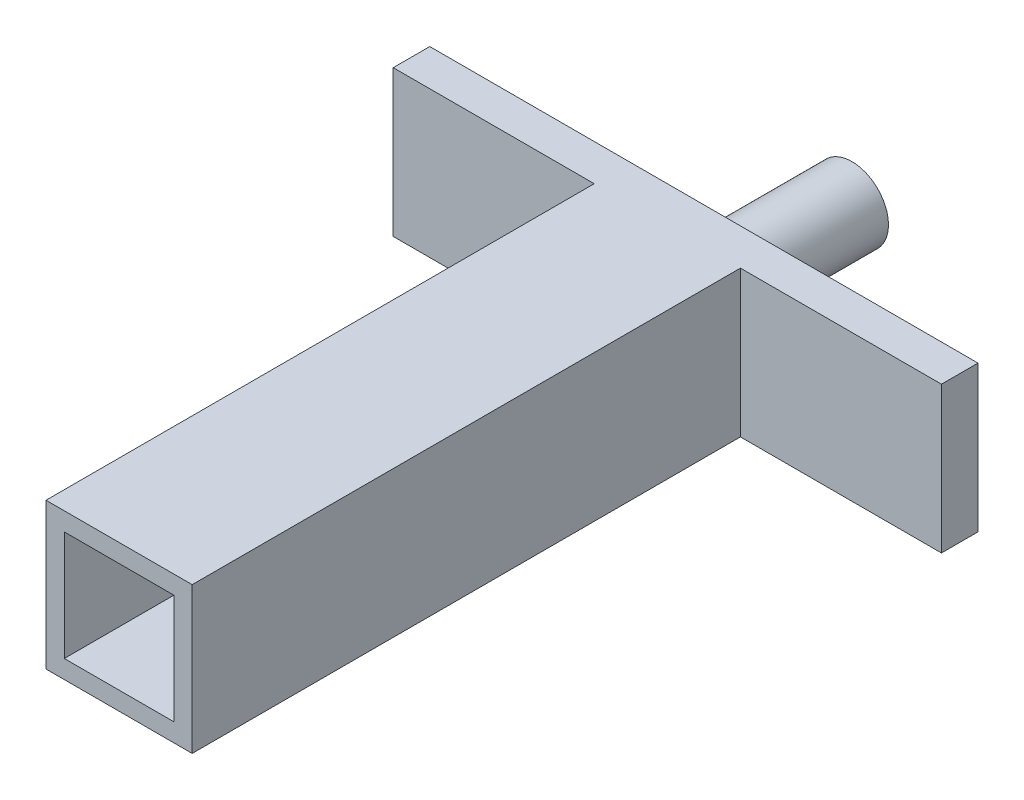
ISO-10303-21;
HEADER;
FILE_DESCRIPTION(('STEP AP214'),'2;1');
FILE_NAME('part.step','',(''),(''),'','','');
FILE_SCHEMA(('AUTOMOTIVE_DESIGN { 1 0 10303 214 1 1 1 1 }'));
ENDSEC;
DATA;
#1=APPLICATION_CONTEXT('core data for automotive mechanical design processes');
#2=APPLICATION_PROTOCOL_DEFINITION('international standard','automotive_design',2000,#1);
#3=PRODUCT_CONTEXT('',#1,'mechanical');
#4=PRODUCT('Part','Part','',(#3));
#5=PRODUCT_RELATED_PRODUCT_CATEGORY('part','',(#4));
#6=PRODUCT_DEFINITION_FORMATION('','',#4);
#7=PRODUCT_DEFINITION_CONTEXT('part definition',#1,'design');
#8=PRODUCT_DEFINITION('design','',#6,#7);
#9=PRODUCT_DEFINITION_SHAPE('','',#8);
#10=(LENGTH_UNIT() NAMED_UNIT(*) SI_UNIT(.MILLI.,.METRE.));
#11=(NAMED_UNIT(*) PLANE_ANGLE_UNIT() SI_UNIT($,.RADIAN.));
#12=(NAMED_UNIT(*) SI_UNIT($,.STERADIAN.) SOLID_ANGLE_UNIT());
#13=UNCERTAINTY_MEASURE_WITH_UNIT(LENGTH_MEASURE(1.E-05),#10,'distance_accuracy_value','');
#14=(GEOMETRIC_REPRESENTATION_CONTEXT(3) GLOBAL_UNCERTAINTY_ASSIGNED_CONTEXT((#13)) GLOBAL_UNIT_ASSIGNED_CONTEXT((#10,
#11,#12)) REPRESENTATION_CONTEXT('',''));
#15=CARTESIAN_POINT('',(0.,0.,0.));
#16=DIRECTION('',(0.,0.,1.));
#17=DIRECTION('',(1.,0.,0.));
#18=AXIS2_PLACEMENT_3D('',#15,#16,#17);
#19=CARTESIAN_POINT('',(2.,2.,16.));
#20=DIRECTION('',(-1.,0.,0.));
#21=DIRECTION('',(0.,-1.,0.));
#22=AXIS2_PLACEMENT_3D('',#19,#20,#21);
#23=PLANE('',#22);
#24=DIRECTION('',(0.,0.,-1.));
#25=VECTOR('',#24,1.);
#26=CARTESIAN_POINT('',(2.,-2.,16.));
#27=LINE('',#26,#25);
#28=CARTESIAN_POINT('',(2.,-2.,16.));
#29=VERTEX_POINT('',#28);
#30=CARTESIAN_POINT('',(2.,-2.,1.));
#31=VERTEX_POINT('',#30);
#32=EDGE_CURVE('E187',#29,#31,#27,.T.);
#33=ORIENTED_EDGE('',*,*,#32,.T.);
#34=DIRECTION('',(0.,1.,0.));
#35=VECTOR('',#34,1.);
#36=CARTESIAN_POINT('',(2.,2.,1.));
#37=LINE('',#36,#35);
#38=CARTESIAN_POINT('',(2.,2.,1.));
#39=VERTEX_POINT('',#38);
#40=EDGE_CURVE('E284',#31,#39,#37,.T.);
#41=ORIENTED_EDGE('',*,*,#40,.T.);
#42=DIRECTION('',(0.,0.,-1.));
#43=VECTOR('',#42,1.);
#44=CARTESIAN_POINT('',(2.,2.,16.));
#45=LINE('',#44,#43);
#46=CARTESIAN_POINT('',(2.,2.,16.));
#47=VERTEX_POINT('',#46);
#48=EDGE_CURVE('E183',#47,#39,#45,.T.);
#49=ORIENTED_EDGE('',*,*,#48,.F.);
#50=DIRECTION('',(0.,1.,0.));
#51=VECTOR('',#50,1.);
#52=CARTESIAN_POINT('',(2.,2.,16.));
#53=LINE('',#52,#51);
#54=EDGE_CURVE('E195',#29,#47,#53,.T.);
#55=ORIENTED_EDGE('',*,*,#54,.F.);
#56=EDGE_LOOP('',(#33,#41,#49,#55));
#57=FACE_BOUND('',#56,.T.);
#58=ADVANCED_FACE('F50',(#57),#23,.F.);
#59=CARTESIAN_POINT('',(-2.,2.,16.));
#60=DIRECTION('',(0.,-1.,0.));
#61=DIRECTION('',(0.,0.,-1.));
#62=AXIS2_PLACEMENT_3D('',#59,#60,#61);
#63=PLANE('',#62);
#64=DIRECTION('',(-1.,0.,0.));
#65=VECTOR('',#64,1.);
#66=CARTESIAN_POINT('',(-2.,2.,0.));
#67=LINE('',#66,#65);
#68=CARTESIAN_POINT('',(7.5,2.,0.));
#69=VERTEX_POINT('',#68);
#70=CARTESIAN_POINT('',(-7.5,2.,0.));
#71=VERTEX_POINT('',#70);
#72=EDGE_CURVE('E196',#69,#71,#67,.T.);
#73=ORIENTED_EDGE('',*,*,#72,.T.);
#74=DIRECTION('',(0.,0.,-1.));
#75=VECTOR('',#74,1.);
#76=CARTESIAN_POINT('',(-7.5,2.,1.));
#77=LINE('',#76,#75);
#78=CARTESIAN_POINT('',(-7.5,2.,1.));
#79=VERTEX_POINT('',#78);
#80=EDGE_CURVE('E178',#79,#71,#77,.T.);
#81=ORIENTED_EDGE('',*,*,#80,.F.);
#82=DIRECTION('',(1.,0.,0.));
#83=VECTOR('',#82,1.);
#84=CARTESIAN_POINT('',(-1.99999999999998,2.,1.));
#85=LINE('',#84,#83);
#86=CARTESIAN_POINT('',(-1.99999999999998,2.,1.));
#87=VERTEX_POINT('',#86);
#88=EDGE_CURVE('E165',#79,#87,#85,.T.);
#89=ORIENTED_EDGE('',*,*,#88,.T.);
#90=DIRECTION('',(0.,0.,-1.));
#91=VECTOR('',#90,1.);
#92=CARTESIAN_POINT('',(-2.,2.,16.));
#93=LINE('',#92,#91);
#94=CARTESIAN_POINT('',(-2.,2.,16.));
#95=VERTEX_POINT('',#94);
#96=EDGE_CURVE('E175',#95,#87,#93,.T.);
#97=ORIENTED_EDGE('',*,*,#96,.F.);
#98=DIRECTION('',(-1.,0.,0.));
#99=VECTOR('',#98,1.);
#100=CARTESIAN_POINT('',(-2.,2.,16.));
#101=LINE('',#100,#99);
#102=EDGE_CURVE('E201',#47,#95,#101,.T.);
#103=ORIENTED_EDGE('',*,*,#102,.F.);
#104=ORIENTED_EDGE('',*,*,#48,.T.);
#105=DIRECTION('',(1.,0.,0.));
#106=VECTOR('',#105,1.);
#107=CARTESIAN_POINT('',(2.,2.,1.));
#108=LINE('',#107,#106);
#109=CARTESIAN_POINT('',(7.5,2.,1.));
#110=VERTEX_POINT('',#109);
#111=EDGE_CURVE('E72',#39,#110,#108,.T.);
#112=ORIENTED_EDGE('',*,*,#111,.T.);
#113=DIRECTION('',(0.,0.,-1.));
#114=VECTOR('',#113,1.);
#115=CARTESIAN_POINT('',(7.5,2.,1.));
#116=LINE('',#115,#114);
#117=EDGE_CURVE('E275',#110,#69,#116,.T.);
#118=ORIENTED_EDGE('',*,*,#117,.T.);
#119=EDGE_LOOP('',(#73,#81,#89,#97,#103,#104,#112,#118));
#120=FACE_BOUND('',#119,.T.);
#121=ADVANCED_FACE('F174',(#120),#63,.F.);
#122=CARTESIAN_POINT('',(-2.,2.,16.));
#123=DIRECTION('',(1.,0.,0.));
#124=DIRECTION('',(0.,1.,0.));
#125=AXIS2_PLACEMENT_3D('',#122,#123,#124);
#126=PLANE('',#125);
#127=ORIENTED_EDGE('',*,*,#96,.T.);
#128=DIRECTION('',(0.,-1.,0.));
#129=VECTOR('',#128,1.);
#130=CARTESIAN_POINT('',(-1.99999999999998,2.,1.));
#131=LINE('',#130,#129);
#132=CARTESIAN_POINT('',(-2.,-2.,1.));
#133=VERTEX_POINT('',#132);
#134=EDGE_CURVE('E162',#87,#133,#131,.T.);
#135=ORIENTED_EDGE('',*,*,#134,.T.);
#136=DIRECTION('',(0.,0.,-1.));
#137=VECTOR('',#136,1.);
#138=CARTESIAN_POINT('',(-2.,-2.,16.));
#139=LINE('',#138,#137);
#140=CARTESIAN_POINT('',(-2.,-2.,16.));
#141=VERTEX_POINT('',#140);
#142=EDGE_CURVE('E184',#141,#133,#139,.T.);
#143=ORIENTED_EDGE('',*,*,#142,.F.);
#144=DIRECTION('',(0.,-1.,0.));
#145=VECTOR('',#144,1.);
#146=CARTESIAN_POINT('',(-2.,2.,16.));
#147=LINE('',#146,#145);
#148=EDGE_CURVE('E182',#95,#141,#147,.T.);
#149=ORIENTED_EDGE('',*,*,#148,.F.);
#150=EDGE_LOOP('',(#127,#135,#143,#149));
#151=FACE_BOUND('',#150,.T.);
#152=ADVANCED_FACE('F181',(#151),#126,.F.);
#153=CARTESIAN_POINT('',(-2.,-2.,16.));
#154=DIRECTION('',(0.,1.,0.));
#155=DIRECTION('',(0.,0.,1.));
#156=AXIS2_PLACEMENT_3D('',#153,#154,#155);
#157=PLANE('',#156);
#158=DIRECTION('',(1.,0.,0.));
#159=VECTOR('',#158,1.);
#160=CARTESIAN_POINT('',(-2.,-2.,0.));
#161=LINE('',#160,#159);
#162=CARTESIAN_POINT('',(-7.5,-2.,0.));
#163=VERTEX_POINT('',#162);
#164=CARTESIAN_POINT('',(7.5,-2.,0.));
#165=VERTEX_POINT('',#164);
#166=EDGE_CURVE('E193',#163,#165,#161,.T.);
#167=ORIENTED_EDGE('',*,*,#166,.T.);
#168=DIRECTION('',(0.,0.,-1.));
#169=VECTOR('',#168,1.);
#170=CARTESIAN_POINT('',(7.5,-2.,1.));
#171=LINE('',#170,#169);
#172=CARTESIAN_POINT('',(7.5,-2.,1.));
#173=VERTEX_POINT('',#172);
#174=EDGE_CURVE('E264',#173,#165,#171,.T.);
#175=ORIENTED_EDGE('',*,*,#174,.F.);
#176=DIRECTION('',(-1.,0.,0.));
#177=VECTOR('',#176,1.);
#178=CARTESIAN_POINT('',(7.5,-2.,1.));
#179=LINE('',#178,#177);
#180=EDGE_CURVE('E278',#173,#31,#179,.T.);
#181=ORIENTED_EDGE('',*,*,#180,.T.);
#182=ORIENTED_EDGE('',*,*,#32,.F.);
#183=DIRECTION('',(1.,0.,0.));
#184=VECTOR('',#183,1.);
#185=CARTESIAN_POINT('',(-2.,-2.,16.));
#186=LINE('',#185,#184);
#187=EDGE_CURVE('E192',#141,#29,#186,.T.);
#188=ORIENTED_EDGE('',*,*,#187,.F.);
#189=ORIENTED_EDGE('',*,*,#142,.T.);
#190=DIRECTION('',(-1.,0.,0.));
#191=VECTOR('',#190,1.);
#192=CARTESIAN_POINT('',(-7.5,-2.,1.));
#193=LINE('',#192,#191);
#194=CARTESIAN_POINT('',(-7.5,-2.,1.));
#195=VERTEX_POINT('',#194);
#196=EDGE_CURVE('E64',#133,#195,#193,.T.);
#197=ORIENTED_EDGE('',*,*,#196,.T.);
#198=DIRECTION('',(0.,0.,-1.));
#199=VECTOR('',#198,1.);
#200=CARTESIAN_POINT('',(-7.5,-2.,1.));
#201=LINE('',#200,#199);
#202=EDGE_CURVE('E292',#195,#163,#201,.T.);
#203=ORIENTED_EDGE('',*,*,#202,.T.);
#204=EDGE_LOOP('',(#167,#175,#181,#182,#188,#189,#197,#203));
#205=FACE_BOUND('',#204,.T.);
#206=ADVANCED_FACE('F301',(#205),#157,.F.);
#207=CARTESIAN_POINT('',(0.,0.,16.));
#208=DIRECTION('',(0.,0.,1.));
#209=DIRECTION('',(1.,0.,0.));
#210=AXIS2_PLACEMENT_3D('',#207,#208,#209);
#211=PLANE('',#210);
#212=DIRECTION('',(0.,1.,0.));
#213=VECTOR('',#212,1.);
#214=CARTESIAN_POINT('',(1.5,2.,16.));
#215=LINE('',#214,#213);
#216=CARTESIAN_POINT('',(1.5,-1.5,16.));
#217=VERTEX_POINT('',#216);
#218=CARTESIAN_POINT('',(1.5,1.5,16.));
#219=VERTEX_POINT('',#218);
#220=EDGE_CURVE('E213',#217,#219,#215,.T.);
#221=ORIENTED_EDGE('',*,*,#220,.F.);
#222=DIRECTION('',(1.,0.,0.));
#223=VECTOR('',#222,1.);
#224=CARTESIAN_POINT('',(-2.,-1.5,16.));
#225=LINE('',#224,#223);
#226=CARTESIAN_POINT('',(-1.5,-1.5,16.));
#227=VERTEX_POINT('',#226);
#228=EDGE_CURVE('E205',#227,#217,#225,.T.);
#229=ORIENTED_EDGE('',*,*,#228,.F.);
#230=DIRECTION('',(0.,-1.,0.));
#231=VECTOR('',#230,1.);
#232=CARTESIAN_POINT('',(-1.5,2.,16.));
#233=LINE('',#232,#231);
#234=CARTESIAN_POINT('',(-1.5,1.5,16.));
#235=VERTEX_POINT('',#234);
#236=EDGE_CURVE('E208',#235,#227,#233,.T.);
#237=ORIENTED_EDGE('',*,*,#236,.F.);
#238=DIRECTION('',(-1.,0.,0.));
#239=VECTOR('',#238,1.);
#240=CARTESIAN_POINT('',(-2.,1.5,16.));
#241=LINE('',#240,#239);
#242=EDGE_CURVE('E211',#219,#235,#241,.T.);
#243=ORIENTED_EDGE('',*,*,#242,.F.);
#244=EDGE_LOOP('',(#221,#229,#237,#243));
#245=FACE_BOUND('',#244,.T.);
#246=ORIENTED_EDGE('',*,*,#54,.T.);
#247=ORIENTED_EDGE('',*,*,#102,.T.);
#248=ORIENTED_EDGE('',*,*,#148,.T.);
#249=ORIENTED_EDGE('',*,*,#187,.T.);
#250=EDGE_LOOP('',(#246,#247,#248,#249));
#251=FACE_BOUND('',#250,.T.);
#252=ADVANCED_FACE('F318',(#245,#251),#211,.T.);
#253=CARTESIAN_POINT('',(0.,0.,0.));
#254=DIRECTION('',(0.,0.,1.));
#255=DIRECTION('',(1.,0.,0.));
#256=AXIS2_PLACEMENT_3D('',#253,#254,#255);
#257=PLANE('',#256);
#258=CARTESIAN_POINT('',(0.,0.,0.));
#259=DIRECTION('',(0.,0.,-1.));
#260=DIRECTION('',(-1.,0.,0.));
#261=AXIS2_PLACEMENT_3D('',#258,#259,#260);
#262=CIRCLE('',#261,0.999999999999999);
#263=CARTESIAN_POINT('',(-0.999999999999999,0.,0.));
#264=VERTEX_POINT('',#263);
#265=EDGE_CURVE('E57',#264,#264,#262,.T.);
#266=ORIENTED_EDGE('',*,*,#265,.F.);
#267=EDGE_LOOP('',(#266));
#268=FACE_BOUND('',#267,.T.);
#269=ORIENTED_EDGE('',*,*,#72,.F.);
#270=DIRECTION('',(0.,-1.,0.));
#271=VECTOR('',#270,1.);
#272=CARTESIAN_POINT('',(7.5,2.,0.));
#273=LINE('',#272,#271);
#274=EDGE_CURVE('E281',#69,#165,#273,.T.);
#275=ORIENTED_EDGE('',*,*,#274,.T.);
#276=ORIENTED_EDGE('',*,*,#166,.F.);
#277=DIRECTION('',(0.,1.,0.));
#278=VECTOR('',#277,1.);
#279=CARTESIAN_POINT('',(-7.5,2.,0.));
#280=LINE('',#279,#278);
#281=EDGE_CURVE('E179',#163,#71,#280,.T.);
#282=ORIENTED_EDGE('',*,*,#281,.T.);
#283=EDGE_LOOP('',(#269,#275,#276,#282));
#284=FACE_BOUND('',#283,.T.);
#285=ADVANCED_FACE('F307',(#268,#284),#257,.F.);
#286=CARTESIAN_POINT('',(1.5,2.,16.));
#287=DIRECTION('',(-1.,0.,0.));
#288=DIRECTION('',(0.,-1.,0.));
#289=AXIS2_PLACEMENT_3D('',#286,#287,#288);
#290=PLANE('',#289);
#291=DIRECTION('',(0.,1.,0.));
#292=VECTOR('',#291,1.);
#293=CARTESIAN_POINT('',(1.5,2.,0.5));
#294=LINE('',#293,#292);
#295=CARTESIAN_POINT('',(1.5,-1.5,0.5));
#296=VERTEX_POINT('',#295);
#297=CARTESIAN_POINT('',(1.5,1.5,0.5));
#298=VERTEX_POINT('',#297);
#299=EDGE_CURVE('E227',#296,#298,#294,.T.);
#300=ORIENTED_EDGE('',*,*,#299,.F.);
#301=DIRECTION('',(0.,0.,-1.));
#302=VECTOR('',#301,1.);
#303=CARTESIAN_POINT('',(1.5,-1.5,16.));
#304=LINE('',#303,#302);
#305=EDGE_CURVE('E207',#217,#296,#304,.T.);
#306=ORIENTED_EDGE('',*,*,#305,.F.);
#307=ORIENTED_EDGE('',*,*,#220,.T.);
#308=DIRECTION('',(0.,0.,-1.));
#309=VECTOR('',#308,1.);
#310=CARTESIAN_POINT('',(1.5,1.5,16.));
#311=LINE('',#310,#309);
#312=EDGE_CURVE('E198',#219,#298,#311,.T.);
#313=ORIENTED_EDGE('',*,*,#312,.T.);
#314=EDGE_LOOP('',(#300,#306,#307,#313));
#315=FACE_BOUND('',#314,.T.);
#316=ADVANCED_FACE('F326',(#315),#290,.T.);
#317=CARTESIAN_POINT('',(-2.,1.5,16.));
#318=DIRECTION('',(0.,-1.,0.));
#319=DIRECTION('',(0.,0.,-1.));
#320=AXIS2_PLACEMENT_3D('',#317,#318,#319);
#321=PLANE('',#320);
#322=DIRECTION('',(-1.,0.,0.));
#323=VECTOR('',#322,1.);
#324=CARTESIAN_POINT('',(-2.,1.5,0.5));
#325=LINE('',#324,#323);
#326=CARTESIAN_POINT('',(-1.5,1.5,0.5));
#327=VERTEX_POINT('',#326);
#328=EDGE_CURVE('E223',#298,#327,#325,.T.);
#329=ORIENTED_EDGE('',*,*,#328,.F.);
#330=ORIENTED_EDGE('',*,*,#312,.F.);
#331=ORIENTED_EDGE('',*,*,#242,.T.);
#332=DIRECTION('',(0.,0.,-1.));
#333=VECTOR('',#332,1.);
#334=CARTESIAN_POINT('',(-1.5,1.5,16.));
#335=LINE('',#334,#333);
#336=EDGE_CURVE('E221',#235,#327,#335,.T.);
#337=ORIENTED_EDGE('',*,*,#336,.T.);
#338=EDGE_LOOP('',(#329,#330,#331,#337));
#339=FACE_BOUND('',#338,.T.);
#340=ADVANCED_FACE('F430',(#339),#321,.T.);
#341=CARTESIAN_POINT('',(-1.5,2.,16.));
#342=DIRECTION('',(1.,0.,0.));
#343=DIRECTION('',(0.,1.,0.));
#344=AXIS2_PLACEMENT_3D('',#341,#342,#343);
#345=PLANE('',#344);
#346=DIRECTION('',(0.,-1.,0.));
#347=VECTOR('',#346,1.);
#348=CARTESIAN_POINT('',(-1.5,2.,0.5));
#349=LINE('',#348,#347);
#350=CARTESIAN_POINT('',(-1.5,-1.5,0.5));
#351=VERTEX_POINT('',#350);
#352=EDGE_CURVE('E217',#327,#351,#349,.T.);
#353=ORIENTED_EDGE('',*,*,#352,.F.);
#354=ORIENTED_EDGE('',*,*,#336,.F.);
#355=ORIENTED_EDGE('',*,*,#236,.T.);
#356=DIRECTION('',(0.,0.,-1.));
#357=VECTOR('',#356,1.);
#358=CARTESIAN_POINT('',(-1.5,-1.5,16.));
#359=LINE('',#358,#357);
#360=EDGE_CURVE('E218',#227,#351,#359,.T.);
#361=ORIENTED_EDGE('',*,*,#360,.T.);
#362=EDGE_LOOP('',(#353,#354,#355,#361));
#363=FACE_BOUND('',#362,.T.);
#364=ADVANCED_FACE('F434',(#363),#345,.T.);
#365=CARTESIAN_POINT('',(-2.,-1.5,16.));
#366=DIRECTION('',(0.,1.,0.));
#367=DIRECTION('',(0.,0.,1.));
#368=AXIS2_PLACEMENT_3D('',#365,#366,#367);
#369=PLANE('',#368);
#370=DIRECTION('',(1.,0.,0.));
#371=VECTOR('',#370,1.);
#372=CARTESIAN_POINT('',(-2.,-1.5,0.5));
#373=LINE('',#372,#371);
#374=EDGE_CURVE('E215',#351,#296,#373,.T.);
#375=ORIENTED_EDGE('',*,*,#374,.F.);
#376=ORIENTED_EDGE('',*,*,#360,.F.);
#377=ORIENTED_EDGE('',*,*,#228,.T.);
#378=ORIENTED_EDGE('',*,*,#305,.T.);
#379=EDGE_LOOP('',(#375,#376,#377,#378));
#380=FACE_BOUND('',#379,.T.);
#381=ADVANCED_FACE('F438',(#380),#369,.T.);
#382=CARTESIAN_POINT('',(0.,0.,0.5));
#383=DIRECTION('',(0.,0.,1.));
#384=DIRECTION('',(1.,0.,0.));
#385=AXIS2_PLACEMENT_3D('',#382,#383,#384);
#386=PLANE('',#385);
#387=ORIENTED_EDGE('',*,*,#299,.T.);
#388=ORIENTED_EDGE('',*,*,#328,.T.);
#389=ORIENTED_EDGE('',*,*,#352,.T.);
#390=ORIENTED_EDGE('',*,*,#374,.T.);
#391=EDGE_LOOP('',(#387,#388,#389,#390));
#392=FACE_BOUND('',#391,.T.);
#393=ADVANCED_FACE('F427',(#392),#386,.T.);
#394=CARTESIAN_POINT('',(0.,0.,-4.));
#395=DIRECTION('',(0.,0.,1.));
#396=DIRECTION('',(1.,0.,0.));
#397=AXIS2_PLACEMENT_3D('',#394,#395,#396);
#398=CYLINDRICAL_SURFACE('',#397,0.999999999999999);
#399=ORIENTED_EDGE('',*,*,#265,.T.);
#400=EDGE_LOOP('',(#399));
#401=FACE_BOUND('',#400,.T.);
#402=CARTESIAN_POINT('',(0.,0.,-4.05));
#403=DIRECTION('',(0.,0.,-1.));
#404=DIRECTION('',(-1.,0.,0.));
#405=AXIS2_PLACEMENT_3D('',#402,#403,#404);
#406=CIRCLE('',#405,0.999999999999999);
#407=CARTESIAN_POINT('',(-0.999999999999999,0.,-4.05));
#408=VERTEX_POINT('',#407);
#409=EDGE_CURVE('E234',#408,#408,#406,.T.);
#410=ORIENTED_EDGE('',*,*,#409,.F.);
#411=EDGE_LOOP('',(#410));
#412=FACE_BOUND('',#411,.T.);
#413=ADVANCED_FACE('F420',(#401,#412),#398,.T.);
#414=CARTESIAN_POINT('',(0.,0.,-4.05));
#415=DIRECTION('',(0.,0.,1.));
#416=DIRECTION('',(1.,0.,0.));
#417=AXIS2_PLACEMENT_3D('',#414,#415,#416);
#418=CYLINDRICAL_SURFACE('',#417,0.849026748061526);
#419=CARTESIAN_POINT('',(0.,0.,-4.05));
#420=DIRECTION('',(0.,0.,-1.));
#421=DIRECTION('',(-1.,0.,0.));
#422=AXIS2_PLACEMENT_3D('',#419,#420,#421);
#423=CIRCLE('',#422,0.849026748061526);
#424=CARTESIAN_POINT('',(-0.849026748061504,0.,-4.05));
#425=VERTEX_POINT('',#424);
#426=EDGE_CURVE('E239',#425,#425,#423,.T.);
#427=ORIENTED_EDGE('',*,*,#426,.T.);
#428=EDGE_LOOP('',(#427));
#429=FACE_BOUND('',#428,.T.);
#430=CARTESIAN_POINT('',(0.,0.,-4.));
#431=DIRECTION('',(0.,0.,-1.));
#432=DIRECTION('',(-1.,0.,0.));
#433=AXIS2_PLACEMENT_3D('',#430,#431,#432);
#434=CIRCLE('',#433,0.849026748061526);
#435=CARTESIAN_POINT('',(-0.849026748061504,0.,-4.));
#436=VERTEX_POINT('',#435);
#437=EDGE_CURVE('E12',#436,#436,#434,.F.);
#438=ORIENTED_EDGE('',*,*,#437,.T.);
#439=EDGE_LOOP('',(#438));
#440=FACE_BOUND('',#439,.T.);
#441=ADVANCED_FACE('F416',(#429,#440),#418,.F.);
#442=CARTESIAN_POINT('',(0.,0.,-4.05));
#443=DIRECTION('',(0.,0.,-1.));
#444=DIRECTION('',(-1.,0.,0.));
#445=AXIS2_PLACEMENT_3D('',#442,#443,#444);
#446=PLANE('',#445);
#447=ORIENTED_EDGE('',*,*,#426,.F.);
#448=EDGE_LOOP('',(#447));
#449=FACE_BOUND('',#448,.T.);
#450=ORIENTED_EDGE('',*,*,#409,.T.);
#451=EDGE_LOOP('',(#450));
#452=FACE_BOUND('',#451,.T.);
#453=ADVANCED_FACE('F413',(#449,#452),#446,.T.);
#454=CARTESIAN_POINT('',(0.,0.,-4.));
#455=DIRECTION('',(0.,0.,-1.));
#456=DIRECTION('',(-1.,0.,0.));
#457=AXIS2_PLACEMENT_3D('',#454,#455,#456);
#458=PLANE('',#457);
#459=CARTESIAN_POINT('',(-0.126262625999991,0.556564640852998,-4.));
#460=DIRECTION('',(0.,0.,-1.));
#461=DIRECTION('',(-1.,0.,0.));
#462=AXIS2_PLACEMENT_3D('',#459,#460,#461);
#463=CIRCLE('',#462,0.126262626);
#464=CARTESIAN_POINT('',(0.,0.556564640852997,-4.));
#465=VERTEX_POINT('',#464);
#466=CARTESIAN_POINT('',(-0.154196839967409,0.679698431562283,-4.));
#467=VERTEX_POINT('',#466);
#468=EDGE_CURVE('E262',#465,#467,#463,.F.);
#469=ORIENTED_EDGE('',*,*,#468,.T.);
#470=CARTESIAN_POINT('',(0.,0.,-4.));
#471=DIRECTION('',(0.,0.,-1.));
#472=DIRECTION('',(-1.,0.,0.));
#473=AXIS2_PLACEMENT_3D('',#470,#471,#472);
#474=CIRCLE('',#473,0.696969600000002);
#475=CARTESIAN_POINT('',(-0.154196839967438,-0.679698431562276,-4.));
#476=VERTEX_POINT('',#475);
#477=EDGE_CURVE('E255',#467,#476,#474,.F.);
#478=ORIENTED_EDGE('',*,*,#477,.T.);
#479=CARTESIAN_POINT('',(-0.126262625999991,-0.556564640852989,-4.));
#480=DIRECTION('',(0.,0.,-1.));
#481=DIRECTION('',(-1.,0.,0.));
#482=AXIS2_PLACEMENT_3D('',#479,#480,#481);
#483=CIRCLE('',#482,0.126262626000004);
#484=CARTESIAN_POINT('',(0.,-0.556564640852989,-4.));
#485=VERTEX_POINT('',#484);
#486=EDGE_CURVE('E258',#476,#485,#483,.F.);
#487=ORIENTED_EDGE('',*,*,#486,.T.);
#488=DIRECTION('',(0.,1.,0.));
#489=VECTOR('',#488,1.);
#490=CARTESIAN_POINT('',(0.,0.,-4.));
#491=LINE('',#490,#489);
#492=EDGE_CURVE('E260',#485,#465,#491,.T.);
#493=ORIENTED_EDGE('',*,*,#492,.T.);
#494=EDGE_LOOP('',(#469,#478,#487,#493));
#495=FACE_BOUND('',#494,.T.);
#496=ORIENTED_EDGE('',*,*,#437,.F.);
#497=EDGE_LOOP('',(#496));
#498=FACE_BOUND('',#497,.T.);
#499=ADVANCED_FACE('F411',(#495,#498),#458,.T.);
#500=CARTESIAN_POINT('',(-0.126262625999991,0.556564640852998,-4.05));
#501=DIRECTION('',(0.,0.,1.));
#502=DIRECTION('',(1.,0.,0.));
#503=AXIS2_PLACEMENT_3D('',#500,#501,#502);
#504=CYLINDRICAL_SURFACE('',#503,0.126262626);
#505=ORIENTED_EDGE('',*,*,#468,.F.);
#506=DIRECTION('',(0.,0.,1.));
#507=VECTOR('',#506,1.);
#508=CARTESIAN_POINT('',(0.,0.556564640852997,-4.05));
#509=LINE('',#508,#507);
#510=CARTESIAN_POINT('',(0.,0.556564640852997,-4.05));
#511=VERTEX_POINT('',#510);
#512=EDGE_CURVE('E242',#511,#465,#509,.T.);
#513=ORIENTED_EDGE('',*,*,#512,.F.);
#514=CARTESIAN_POINT('',(-0.126262625999991,0.556564640852998,-4.05));
#515=DIRECTION('',(0.,0.,-1.));
#516=DIRECTION('',(-1.,0.,0.));
#517=AXIS2_PLACEMENT_3D('',#514,#515,#516);
#518=CIRCLE('',#517,0.126262626);
#519=CARTESIAN_POINT('',(-0.154196839967409,0.679698431562283,-4.05));
#520=VERTEX_POINT('',#519);
#521=EDGE_CURVE('E257',#511,#520,#518,.F.);
#522=ORIENTED_EDGE('',*,*,#521,.T.);
#523=DIRECTION('',(0.,0.,1.));
#524=VECTOR('',#523,1.);
#525=CARTESIAN_POINT('',(-0.154196839967409,0.679698431562283,-4.05));
#526=LINE('',#525,#524);
#527=EDGE_CURVE('E251',#520,#467,#526,.T.);
#528=ORIENTED_EDGE('',*,*,#527,.T.);
#529=EDGE_LOOP('',(#505,#513,#522,#528));
#530=FACE_BOUND('',#529,.T.);
#531=ADVANCED_FACE('F407',(#530),#504,.T.);
#532=CARTESIAN_POINT('',(0.,0.,-4.05));
#533=DIRECTION('',(1.,0.,0.));
#534=DIRECTION('',(0.,0.,-1.));
#535=AXIS2_PLACEMENT_3D('',#532,#533,#534);
#536=PLANE('',#535);
#537=ORIENTED_EDGE('',*,*,#492,.F.);
#538=DIRECTION('',(0.,0.,1.));
#539=VECTOR('',#538,1.);
#540=CARTESIAN_POINT('',(0.,-0.556564640852989,-4.05));
#541=LINE('',#540,#539);
#542=CARTESIAN_POINT('',(0.,-0.556564640852989,-4.05));
#543=VERTEX_POINT('',#542);
#544=EDGE_CURVE('E245',#543,#485,#541,.T.);
#545=ORIENTED_EDGE('',*,*,#544,.F.);
#546=DIRECTION('',(0.,1.,0.));
#547=VECTOR('',#546,1.);
#548=CARTESIAN_POINT('',(0.,0.,-4.05));
#549=LINE('',#548,#547);
#550=EDGE_CURVE('E270',#543,#511,#549,.T.);
#551=ORIENTED_EDGE('',*,*,#550,.T.);
#552=ORIENTED_EDGE('',*,*,#512,.T.);
#553=EDGE_LOOP('',(#537,#545,#551,#552));
#554=FACE_BOUND('',#553,.T.);
#555=ADVANCED_FACE('F403',(#554),#536,.T.);
#556=CARTESIAN_POINT('',(-0.126262625999991,-0.556564640852989,-4.05));
#557=DIRECTION('',(0.,0.,1.));
#558=DIRECTION('',(1.,0.,0.));
#559=AXIS2_PLACEMENT_3D('',#556,#557,#558);
#560=CYLINDRICAL_SURFACE('',#559,0.126262626000004);
#561=ORIENTED_EDGE('',*,*,#486,.F.);
#562=DIRECTION('',(0.,0.,1.));
#563=VECTOR('',#562,1.);
#564=CARTESIAN_POINT('',(-0.154196839967438,-0.679698431562273,-4.05));
#565=LINE('',#564,#563);
#566=CARTESIAN_POINT('',(-0.154196839967438,-0.679698431562273,-4.05));
#567=VERTEX_POINT('',#566);
#568=EDGE_CURVE('E248',#567,#476,#565,.T.);
#569=ORIENTED_EDGE('',*,*,#568,.F.);
#570=CARTESIAN_POINT('',(-0.126262625999991,-0.556564640852989,-4.05));
#571=DIRECTION('',(0.,0.,-1.));
#572=DIRECTION('',(-1.,0.,0.));
#573=AXIS2_PLACEMENT_3D('',#570,#571,#572);
#574=CIRCLE('',#573,0.126262626000004);
#575=EDGE_CURVE('E267',#567,#543,#574,.F.);
#576=ORIENTED_EDGE('',*,*,#575,.T.);
#577=ORIENTED_EDGE('',*,*,#544,.T.);
#578=EDGE_LOOP('',(#561,#569,#576,#577));
#579=FACE_BOUND('',#578,.T.);
#580=ADVANCED_FACE('F399',(#579),#560,.T.);
#581=CARTESIAN_POINT('',(0.,0.,-4.05));
#582=DIRECTION('',(0.,0.,1.));
#583=DIRECTION('',(1.,0.,0.));
#584=AXIS2_PLACEMENT_3D('',#581,#582,#583);
#585=CYLINDRICAL_SURFACE('',#584,0.696969600000002);
#586=ORIENTED_EDGE('',*,*,#477,.F.);
#587=ORIENTED_EDGE('',*,*,#527,.F.);
#588=CARTESIAN_POINT('',(0.,0.,-4.05));
#589=DIRECTION('',(0.,0.,-1.));
#590=DIRECTION('',(-1.,0.,0.));
#591=AXIS2_PLACEMENT_3D('',#588,#589,#590);
#592=CIRCLE('',#591,0.696969600000002);
#593=EDGE_CURVE('E254',#520,#567,#592,.F.);
#594=ORIENTED_EDGE('',*,*,#593,.T.);
#595=ORIENTED_EDGE('',*,*,#568,.T.);
#596=EDGE_LOOP('',(#586,#587,#594,#595));
#597=FACE_BOUND('',#596,.T.);
#598=ADVANCED_FACE('F395',(#597),#585,.T.);
#599=CARTESIAN_POINT('',(0.,0.,-4.05));
#600=DIRECTION('',(0.,0.,-1.));
#601=DIRECTION('',(-1.,0.,0.));
#602=AXIS2_PLACEMENT_3D('',#599,#600,#601);
#603=PLANE('',#602);
#604=ORIENTED_EDGE('',*,*,#521,.F.);
#605=ORIENTED_EDGE('',*,*,#550,.F.);
#606=ORIENTED_EDGE('',*,*,#575,.F.);
#607=ORIENTED_EDGE('',*,*,#593,.F.);
#608=EDGE_LOOP('',(#604,#605,#606,#607));
#609=FACE_BOUND('',#608,.T.);
#610=ADVANCED_FACE('F364',(#609),#603,.T.);
#611=CARTESIAN_POINT('',(7.5,2.,1.));
#612=DIRECTION('',(1.,0.,0.));
#613=DIRECTION('',(0.,1.,0.));
#614=AXIS2_PLACEMENT_3D('',#611,#612,#613);
#615=PLANE('',#614);
#616=ORIENTED_EDGE('',*,*,#274,.F.);
#617=ORIENTED_EDGE('',*,*,#117,.F.);
#618=DIRECTION('',(0.,-1.,0.));
#619=VECTOR('',#618,1.);
#620=CARTESIAN_POINT('',(7.5,2.,1.));
#621=LINE('',#620,#619);
#622=EDGE_CURVE('E287',#110,#173,#621,.T.);
#623=ORIENTED_EDGE('',*,*,#622,.T.);
#624=ORIENTED_EDGE('',*,*,#174,.T.);
#625=EDGE_LOOP('',(#616,#617,#623,#624));
#626=FACE_BOUND('',#625,.T.);
#627=ADVANCED_FACE('F310',(#626),#615,.T.);
#628=CARTESIAN_POINT('',(0.,0.,1.));
#629=DIRECTION('',(0.,0.,-1.));
#630=DIRECTION('',(-1.,0.,0.));
#631=AXIS2_PLACEMENT_3D('',#628,#629,#630);
#632=PLANE('',#631);
#633=ORIENTED_EDGE('',*,*,#40,.F.);
#634=ORIENTED_EDGE('',*,*,#180,.F.);
#635=ORIENTED_EDGE('',*,*,#622,.F.);
#636=ORIENTED_EDGE('',*,*,#111,.F.);
#637=EDGE_LOOP('',(#633,#634,#635,#636));
#638=FACE_BOUND('',#637,.T.);
#639=ADVANCED_FACE('F312',(#638),#632,.F.);
#640=CARTESIAN_POINT('',(-7.5,2.,1.));
#641=DIRECTION('',(-1.,0.,0.));
#642=DIRECTION('',(0.,-1.,0.));
#643=AXIS2_PLACEMENT_3D('',#640,#641,#642);
#644=PLANE('',#643);
#645=ORIENTED_EDGE('',*,*,#281,.F.);
#646=ORIENTED_EDGE('',*,*,#202,.F.);
#647=DIRECTION('',(0.,1.,0.));
#648=VECTOR('',#647,1.);
#649=CARTESIAN_POINT('',(-7.5,2.,1.));
#650=LINE('',#649,#648);
#651=EDGE_CURVE('E295',#195,#79,#650,.T.);
#652=ORIENTED_EDGE('',*,*,#651,.T.);
#653=ORIENTED_EDGE('',*,*,#80,.T.);
#654=EDGE_LOOP('',(#645,#646,#652,#653));
#655=FACE_BOUND('',#654,.T.);
#656=ADVANCED_FACE('F305',(#655),#644,.T.);
#657=CARTESIAN_POINT('',(0.,0.,1.));
#658=DIRECTION('',(0.,0.,1.));
#659=DIRECTION('',(1.,0.,0.));
#660=AXIS2_PLACEMENT_3D('',#657,#658,#659);
#661=PLANE('',#660);
#662=ORIENTED_EDGE('',*,*,#88,.F.);
#663=ORIENTED_EDGE('',*,*,#651,.F.);
#664=ORIENTED_EDGE('',*,*,#196,.F.);
#665=ORIENTED_EDGE('',*,*,#134,.F.);
#666=EDGE_LOOP('',(#662,#663,#664,#665));
#667=FACE_BOUND('',#666,.T.);
#668=ADVANCED_FACE('F164',(#667),#661,.T.);
#669=CLOSED_SHELL('',(#58,#121,#152,#206,#252,#285,#316,#340,#364,#381,#393,#413,#441,#453,#499,
#531,#555,#580,#598,#610,#627,#639,#656,#668));
#670=MANIFOLD_SOLID_BREP('B2',#669);
#671=ADVANCED_BREP_SHAPE_REPRESENTATION('',(#18,#670),#14);
#672=SHAPE_DEFINITION_REPRESENTATION(#9,#671);
ENDSEC;
END-ISO-10303-21;
